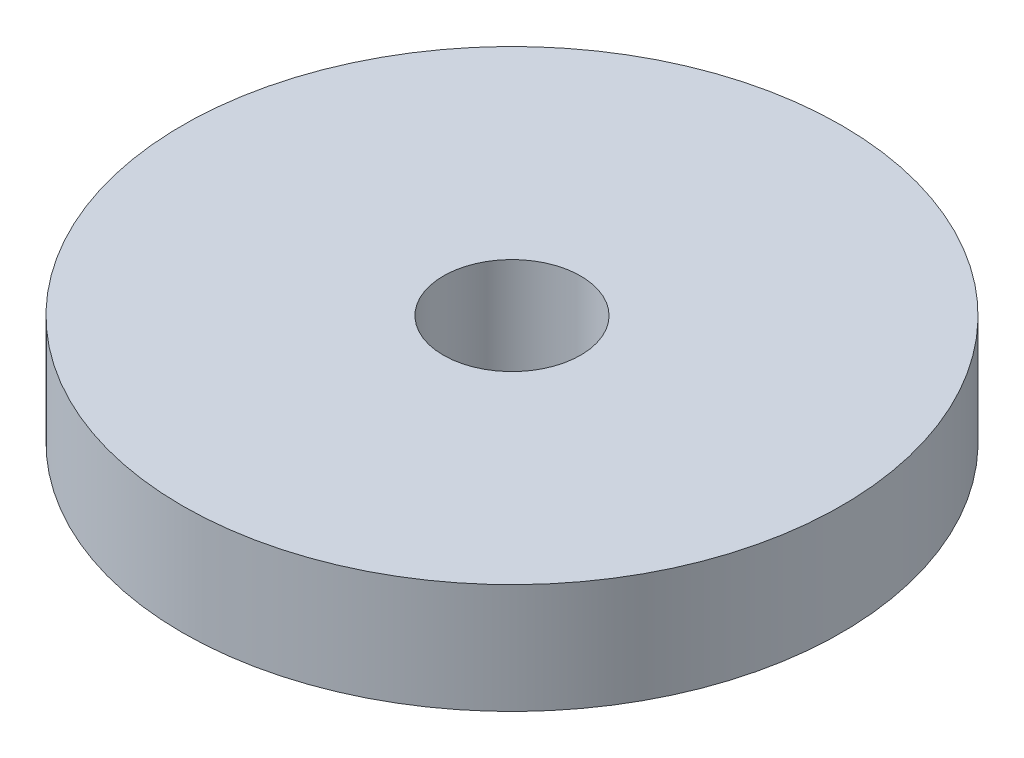
ISO-10303-21;
HEADER;
FILE_DESCRIPTION(('STEP AP214'),'2;1');
FILE_NAME('part.step','',(''),(''),'','','');
FILE_SCHEMA(('AUTOMOTIVE_DESIGN { 1 0 10303 214 1 1 1 1 }'));
ENDSEC;
DATA;
#1=APPLICATION_CONTEXT('core data for automotive mechanical design processes');
#2=APPLICATION_PROTOCOL_DEFINITION('international standard','automotive_design',2000,#1);
#3=PRODUCT_CONTEXT('',#1,'mechanical');
#4=PRODUCT('Part','Part','',(#3));
#5=PRODUCT_RELATED_PRODUCT_CATEGORY('part','',(#4));
#6=PRODUCT_DEFINITION_FORMATION('','',#4);
#7=PRODUCT_DEFINITION_CONTEXT('part definition',#1,'design');
#8=PRODUCT_DEFINITION('design','',#6,#7);
#9=PRODUCT_DEFINITION_SHAPE('','',#8);
#10=(LENGTH_UNIT() NAMED_UNIT(*) SI_UNIT(.MILLI.,.METRE.));
#11=(NAMED_UNIT(*) PLANE_ANGLE_UNIT() SI_UNIT($,.RADIAN.));
#12=(NAMED_UNIT(*) SI_UNIT($,.STERADIAN.) SOLID_ANGLE_UNIT());
#13=UNCERTAINTY_MEASURE_WITH_UNIT(LENGTH_MEASURE(1.E-05),#10,'distance_accuracy_value','');
#14=(GEOMETRIC_REPRESENTATION_CONTEXT(3) GLOBAL_UNCERTAINTY_ASSIGNED_CONTEXT((#13)) GLOBAL_UNIT_ASSIGNED_CONTEXT((#10,
#11,#12)) REPRESENTATION_CONTEXT('',''));
#15=CARTESIAN_POINT('',(0.,0.,0.));
#16=DIRECTION('',(0.,0.,1.));
#17=DIRECTION('',(1.,0.,0.));
#18=AXIS2_PLACEMENT_3D('',#15,#16,#17);
#19=CARTESIAN_POINT('',(0.,5.08,0.));
#20=DIRECTION('',(0.,1.,0.));
#21=DIRECTION('',(0.,0.,1.));
#22=AXIS2_PLACEMENT_3D('',#19,#20,#21);
#23=PLANE('',#22);
#24=CARTESIAN_POINT('',(0.,5.08,0.));
#25=DIRECTION('',(0.,1.,0.));
#26=DIRECTION('',(0.,0.,1.));
#27=AXIS2_PLACEMENT_3D('',#24,#25,#26);
#28=CIRCLE('',#27,15.24);
#29=CARTESIAN_POINT('',(0.,5.08,15.24));
#30=VERTEX_POINT('',#29);
#31=EDGE_CURVE('E10',#30,#30,#28,.T.);
#32=ORIENTED_EDGE('',*,*,#31,.T.);
#33=EDGE_LOOP('',(#32));
#34=FACE_BOUND('',#33,.T.);
#35=CARTESIAN_POINT('',(0.,5.08,0.));
#36=DIRECTION('',(0.,1.,0.));
#37=DIRECTION('',(0.,0.,1.));
#38=AXIS2_PLACEMENT_3D('',#35,#36,#37);
#39=CIRCLE('',#38,3.175);
#40=CARTESIAN_POINT('',(0.,5.08,3.175));
#41=VERTEX_POINT('',#40);
#42=EDGE_CURVE('E41',#41,#41,#39,.T.);
#43=ORIENTED_EDGE('',*,*,#42,.F.);
#44=EDGE_LOOP('',(#43));
#45=FACE_BOUND('',#44,.T.);
#46=ADVANCED_FACE('F30',(#34,#45),#23,.T.);
#47=CARTESIAN_POINT('',(0.,0.,0.));
#48=DIRECTION('',(0.,1.,0.));
#49=DIRECTION('',(0.,0.,1.));
#50=AXIS2_PLACEMENT_3D('',#47,#48,#49);
#51=PLANE('',#50);
#52=CARTESIAN_POINT('',(0.,0.,0.));
#53=DIRECTION('',(0.,1.,0.));
#54=DIRECTION('',(0.,0.,1.));
#55=AXIS2_PLACEMENT_3D('',#52,#53,#54);
#56=CIRCLE('',#55,15.24);
#57=CARTESIAN_POINT('',(0.,0.,15.24));
#58=VERTEX_POINT('',#57);
#59=EDGE_CURVE('E34',#58,#58,#56,.T.);
#60=ORIENTED_EDGE('',*,*,#59,.F.);
#61=EDGE_LOOP('',(#60));
#62=FACE_BOUND('',#61,.T.);
#63=CARTESIAN_POINT('',(0.,0.,0.));
#64=DIRECTION('',(0.,1.,0.));
#65=DIRECTION('',(0.,0.,1.));
#66=AXIS2_PLACEMENT_3D('',#63,#64,#65);
#67=CIRCLE('',#66,3.175);
#68=CARTESIAN_POINT('',(0.,0.,3.175));
#69=VERTEX_POINT('',#68);
#70=EDGE_CURVE('E43',#69,#69,#67,.T.);
#71=ORIENTED_EDGE('',*,*,#70,.T.);
#72=EDGE_LOOP('',(#71));
#73=FACE_BOUND('',#72,.T.);
#74=ADVANCED_FACE('F53',(#62,#73),#51,.F.);
#75=CARTESIAN_POINT('',(0.,5.08,0.));
#76=DIRECTION('',(0.,-1.,0.));
#77=DIRECTION('',(0.,0.,-1.));
#78=AXIS2_PLACEMENT_3D('',#75,#76,#77);
#79=CYLINDRICAL_SURFACE('',#78,15.24);
#80=ORIENTED_EDGE('',*,*,#31,.F.);
#81=EDGE_LOOP('',(#80));
#82=FACE_BOUND('',#81,.T.);
#83=ORIENTED_EDGE('',*,*,#59,.T.);
#84=EDGE_LOOP('',(#83));
#85=FACE_BOUND('',#84,.T.);
#86=ADVANCED_FACE('F32',(#82,#85),#79,.T.);
#87=CARTESIAN_POINT('',(0.,5.08,0.));
#88=DIRECTION('',(0.,-1.,0.));
#89=DIRECTION('',(0.,0.,-1.));
#90=AXIS2_PLACEMENT_3D('',#87,#88,#89);
#91=CYLINDRICAL_SURFACE('',#90,3.175);
#92=ORIENTED_EDGE('',*,*,#42,.T.);
#93=EDGE_LOOP('',(#92));
#94=FACE_BOUND('',#93,.T.);
#95=ORIENTED_EDGE('',*,*,#70,.F.);
#96=EDGE_LOOP('',(#95));
#97=FACE_BOUND('',#96,.T.);
#98=ADVANCED_FACE('F49',(#94,#97),#91,.F.);
#99=CLOSED_SHELL('',(#46,#74,#86,#98));
#100=MANIFOLD_SOLID_BREP('B2',#99);
#101=ADVANCED_BREP_SHAPE_REPRESENTATION('',(#18,#100),#14);
#102=SHAPE_DEFINITION_REPRESENTATION(#9,#101);
ENDSEC;
END-ISO-10303-21;
